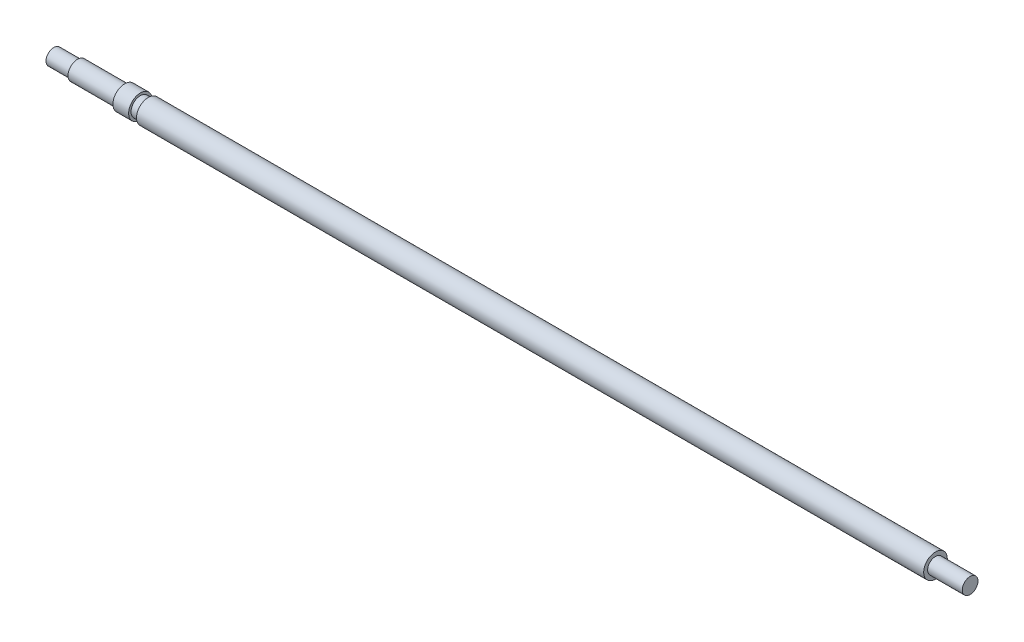
ISO-10303-21;
HEADER;
FILE_DESCRIPTION(('STEP AP214'),'2;1');
FILE_NAME('part.step','',(''),(''),'','','');
FILE_SCHEMA(('AUTOMOTIVE_DESIGN { 1 0 10303 214 1 1 1 1 }'));
ENDSEC;
DATA;
#1=APPLICATION_CONTEXT('core data for automotive mechanical design processes');
#2=APPLICATION_PROTOCOL_DEFINITION('international standard','automotive_design',2000,#1);
#3=PRODUCT_CONTEXT('',#1,'mechanical');
#4=PRODUCT('Part','Part','',(#3));
#5=PRODUCT_RELATED_PRODUCT_CATEGORY('part','',(#4));
#6=PRODUCT_DEFINITION_FORMATION('','',#4);
#7=PRODUCT_DEFINITION_CONTEXT('part definition',#1,'design');
#8=PRODUCT_DEFINITION('design','',#6,#7);
#9=PRODUCT_DEFINITION_SHAPE('','',#8);
#10=(LENGTH_UNIT() NAMED_UNIT(*) SI_UNIT(.MILLI.,.METRE.));
#11=(NAMED_UNIT(*) PLANE_ANGLE_UNIT() SI_UNIT($,.RADIAN.));
#12=(NAMED_UNIT(*) SI_UNIT($,.STERADIAN.) SOLID_ANGLE_UNIT());
#13=UNCERTAINTY_MEASURE_WITH_UNIT(LENGTH_MEASURE(1.E-05),#10,'distance_accuracy_value','');
#14=(GEOMETRIC_REPRESENTATION_CONTEXT(3) GLOBAL_UNCERTAINTY_ASSIGNED_CONTEXT((#13)) GLOBAL_UNIT_ASSIGNED_CONTEXT((#10,
#11,#12)) REPRESENTATION_CONTEXT('',''));
#15=CARTESIAN_POINT('',(0.,0.,0.));
#16=DIRECTION('',(0.,0.,1.));
#17=DIRECTION('',(1.,0.,0.));
#18=AXIS2_PLACEMENT_3D('',#15,#16,#17);
#19=CARTESIAN_POINT('',(3983.11986087225,589.332150706548,0.));
#20=DIRECTION('',(-1.,0.,0.));
#21=DIRECTION('',(0.,0.,1.));
#22=AXIS2_PLACEMENT_3D('',#19,#20,#21);
#23=PLANE('',#22);
#24=CARTESIAN_POINT('',(3983.11986087225,584.332150706548,0.));
#25=DIRECTION('',(1.,0.,0.));
#26=DIRECTION('',(0.,0.,-1.));
#27=AXIS2_PLACEMENT_3D('',#24,#25,#26);
#28=CIRCLE('',#27,5.);
#29=CARTESIAN_POINT('',(3983.11986087225,584.332150706548,-5.));
#30=VERTEX_POINT('',#29);
#31=EDGE_CURVE('E10',#30,#30,#28,.T.);
#32=ORIENTED_EDGE('',*,*,#31,.F.);
#33=EDGE_LOOP('',(#32));
#34=FACE_BOUND('',#33,.T.);
#35=ADVANCED_FACE('F31',(#34),#23,.T.);
#36=CARTESIAN_POINT('',(4565.11986087225,584.332150706548,0.));
#37=DIRECTION('',(1.,0.,0.));
#38=DIRECTION('',(0.,0.,-1.));
#39=AXIS2_PLACEMENT_3D('',#36,#37,#38);
#40=CYLINDRICAL_SURFACE('',#39,5.);
#41=ORIENTED_EDGE('',*,*,#31,.T.);
#42=EDGE_LOOP('',(#41));
#43=FACE_BOUND('',#42,.T.);
#44=CARTESIAN_POINT('',(3998.11986087225,584.332150706548,0.));
#45=DIRECTION('',(1.,0.,0.));
#46=DIRECTION('',(0.,0.,-1.));
#47=AXIS2_PLACEMENT_3D('',#44,#45,#46);
#48=CIRCLE('',#47,5.);
#49=CARTESIAN_POINT('',(3998.11986087225,584.332150706548,-5.));
#50=VERTEX_POINT('',#49);
#51=EDGE_CURVE('E37',#50,#50,#48,.T.);
#52=ORIENTED_EDGE('',*,*,#51,.F.);
#53=EDGE_LOOP('',(#52));
#54=FACE_BOUND('',#53,.T.);
#55=ADVANCED_FACE('F91',(#43,#54),#40,.T.);
#56=CARTESIAN_POINT('',(3998.11986087225,589.332150706548,0.));
#57=DIRECTION('',(-1.,0.,0.));
#58=DIRECTION('',(0.,0.,1.));
#59=AXIS2_PLACEMENT_3D('',#56,#57,#58);
#60=PLANE('',#59);
#61=ORIENTED_EDGE('',*,*,#51,.T.);
#62=EDGE_LOOP('',(#61));
#63=FACE_BOUND('',#62,.T.);
#64=CARTESIAN_POINT('',(3998.11986087225,584.332150706548,0.));
#65=DIRECTION('',(1.,0.,0.));
#66=DIRECTION('',(0.,0.,-1.));
#67=AXIS2_PLACEMENT_3D('',#64,#65,#66);
#68=CIRCLE('',#67,6.00000000000001);
#69=CARTESIAN_POINT('',(3998.11986087225,584.332150706548,-6.00000000000001));
#70=VERTEX_POINT('',#69);
#71=EDGE_CURVE('E41',#70,#70,#68,.T.);
#72=ORIENTED_EDGE('',*,*,#71,.F.);
#73=EDGE_LOOP('',(#72));
#74=FACE_BOUND('',#73,.T.);
#75=ADVANCED_FACE('F96',(#63,#74),#60,.T.);
#76=CARTESIAN_POINT('',(4565.11986087225,584.332150706548,0.));
#77=DIRECTION('',(1.,0.,0.));
#78=DIRECTION('',(0.,0.,-1.));
#79=AXIS2_PLACEMENT_3D('',#76,#77,#78);
#80=CYLINDRICAL_SURFACE('',#79,6.00000000000001);
#81=ORIENTED_EDGE('',*,*,#71,.T.);
#82=EDGE_LOOP('',(#81));
#83=FACE_BOUND('',#82,.T.);
#84=CARTESIAN_POINT('',(4028.11986087225,584.332150706548,0.));
#85=DIRECTION('',(1.,0.,0.));
#86=DIRECTION('',(0.,0.,-1.));
#87=AXIS2_PLACEMENT_3D('',#84,#85,#86);
#88=CIRCLE('',#87,6.00000000000001);
#89=CARTESIAN_POINT('',(4028.11986087225,584.332150706548,-6.00000000000001));
#90=VERTEX_POINT('',#89);
#91=EDGE_CURVE('E45',#90,#90,#88,.T.);
#92=ORIENTED_EDGE('',*,*,#91,.F.);
#93=EDGE_LOOP('',(#92));
#94=FACE_BOUND('',#93,.T.);
#95=ADVANCED_FACE('F100',(#83,#94),#80,.T.);
#96=CARTESIAN_POINT('',(4028.11986087225,590.332150706548,0.));
#97=DIRECTION('',(-1.,0.,0.));
#98=DIRECTION('',(0.,0.,1.));
#99=AXIS2_PLACEMENT_3D('',#96,#97,#98);
#100=PLANE('',#99);
#101=ORIENTED_EDGE('',*,*,#91,.T.);
#102=EDGE_LOOP('',(#101));
#103=FACE_BOUND('',#102,.T.);
#104=CARTESIAN_POINT('',(4028.11986087225,584.332150706548,0.));
#105=DIRECTION('',(1.,0.,0.));
#106=DIRECTION('',(0.,0.,-1.));
#107=AXIS2_PLACEMENT_3D('',#104,#105,#106);
#108=CIRCLE('',#107,7.49999999999995);
#109=CARTESIAN_POINT('',(4028.11986087225,584.332150706548,-7.49999999999995));
#110=VERTEX_POINT('',#109);
#111=EDGE_CURVE('E50',#110,#110,#108,.T.);
#112=ORIENTED_EDGE('',*,*,#111,.F.);
#113=EDGE_LOOP('',(#112));
#114=FACE_BOUND('',#113,.T.);
#115=ADVANCED_FACE('F106',(#103,#114),#100,.T.);
#116=CARTESIAN_POINT('',(4565.11986087225,584.332150706548,0.));
#117=DIRECTION('',(1.,0.,0.));
#118=DIRECTION('',(0.,0.,-1.));
#119=AXIS2_PLACEMENT_3D('',#116,#117,#118);
#120=CYLINDRICAL_SURFACE('',#119,7.49999999999995);
#121=ORIENTED_EDGE('',*,*,#111,.T.);
#122=EDGE_LOOP('',(#121));
#123=FACE_BOUND('',#122,.T.);
#124=CARTESIAN_POINT('',(4038.11986087225,584.332150706548,0.));
#125=DIRECTION('',(1.,0.,0.));
#126=DIRECTION('',(0.,0.,-1.));
#127=AXIS2_PLACEMENT_3D('',#124,#125,#126);
#128=CIRCLE('',#127,7.49999999999995);
#129=CARTESIAN_POINT('',(4038.11986087225,584.332150706548,-7.49999999999995));
#130=VERTEX_POINT('',#129);
#131=EDGE_CURVE('E53',#130,#130,#128,.T.);
#132=ORIENTED_EDGE('',*,*,#131,.F.);
#133=EDGE_LOOP('',(#132));
#134=FACE_BOUND('',#133,.T.);
#135=ADVANCED_FACE('F110',(#123,#134),#120,.T.);
#136=CARTESIAN_POINT('',(4038.11986087225,590.332150706548,0.));
#137=DIRECTION('',(1.,0.,0.));
#138=DIRECTION('',(0.,0.,-1.));
#139=AXIS2_PLACEMENT_3D('',#136,#137,#138);
#140=PLANE('',#139);
#141=ORIENTED_EDGE('',*,*,#131,.T.);
#142=EDGE_LOOP('',(#141));
#143=FACE_BOUND('',#142,.T.);
#144=CARTESIAN_POINT('',(4038.11986087225,584.332150706548,0.));
#145=DIRECTION('',(1.,0.,0.));
#146=DIRECTION('',(0.,0.,-1.));
#147=AXIS2_PLACEMENT_3D('',#144,#145,#146);
#148=CIRCLE('',#147,6.00000000000001);
#149=CARTESIAN_POINT('',(4038.11986087225,584.332150706548,-6.00000000000001));
#150=VERTEX_POINT('',#149);
#151=EDGE_CURVE('E56',#150,#150,#148,.T.);
#152=ORIENTED_EDGE('',*,*,#151,.F.);
#153=EDGE_LOOP('',(#152));
#154=FACE_BOUND('',#153,.T.);
#155=ADVANCED_FACE('F114',(#143,#154),#140,.T.);
#156=CARTESIAN_POINT('',(4565.11986087225,584.332150706548,0.));
#157=DIRECTION('',(1.,0.,0.));
#158=DIRECTION('',(0.,0.,-1.));
#159=AXIS2_PLACEMENT_3D('',#156,#157,#158);
#160=CYLINDRICAL_SURFACE('',#159,6.00000000000001);
#161=ORIENTED_EDGE('',*,*,#151,.T.);
#162=EDGE_LOOP('',(#161));
#163=FACE_BOUND('',#162,.T.);
#164=CARTESIAN_POINT('',(4043.11986087225,584.332150706548,0.));
#165=DIRECTION('',(1.,0.,0.));
#166=DIRECTION('',(0.,0.,-1.));
#167=AXIS2_PLACEMENT_3D('',#164,#165,#166);
#168=CIRCLE('',#167,6.00000000000001);
#169=CARTESIAN_POINT('',(4043.11986087225,584.332150706548,-6.00000000000001));
#170=VERTEX_POINT('',#169);
#171=EDGE_CURVE('E59',#170,#170,#168,.T.);
#172=ORIENTED_EDGE('',*,*,#171,.F.);
#173=EDGE_LOOP('',(#172));
#174=FACE_BOUND('',#173,.T.);
#175=ADVANCED_FACE('F118',(#163,#174),#160,.T.);
#176=CARTESIAN_POINT('',(4043.11986087225,590.332150706548,0.));
#177=DIRECTION('',(-1.,0.,0.));
#178=DIRECTION('',(0.,0.,1.));
#179=AXIS2_PLACEMENT_3D('',#176,#177,#178);
#180=PLANE('',#179);
#181=ORIENTED_EDGE('',*,*,#171,.T.);
#182=EDGE_LOOP('',(#181));
#183=FACE_BOUND('',#182,.T.);
#184=CARTESIAN_POINT('',(4043.11986087225,584.332150706548,0.));
#185=DIRECTION('',(1.,0.,0.));
#186=DIRECTION('',(0.,0.,-1.));
#187=AXIS2_PLACEMENT_3D('',#184,#185,#186);
#188=CIRCLE('',#187,7.49999999999995);
#189=CARTESIAN_POINT('',(4043.11986087225,584.332150706548,-7.49999999999995));
#190=VERTEX_POINT('',#189);
#191=EDGE_CURVE('E62',#190,#190,#188,.T.);
#192=ORIENTED_EDGE('',*,*,#191,.F.);
#193=EDGE_LOOP('',(#192));
#194=FACE_BOUND('',#193,.T.);
#195=ADVANCED_FACE('F122',(#183,#194),#180,.T.);
#196=CARTESIAN_POINT('',(4565.11986087225,584.332150706548,0.));
#197=DIRECTION('',(1.,0.,0.));
#198=DIRECTION('',(0.,0.,-1.));
#199=AXIS2_PLACEMENT_3D('',#196,#197,#198);
#200=CYLINDRICAL_SURFACE('',#199,7.49999999999995);
#201=ORIENTED_EDGE('',*,*,#191,.T.);
#202=EDGE_LOOP('',(#201));
#203=FACE_BOUND('',#202,.T.);
#204=CARTESIAN_POINT('',(4543.11986087225,584.332150706548,0.));
#205=DIRECTION('',(1.,0.,0.));
#206=DIRECTION('',(0.,0.,-1.));
#207=AXIS2_PLACEMENT_3D('',#204,#205,#206);
#208=CIRCLE('',#207,7.49999999999995);
#209=CARTESIAN_POINT('',(4543.11986087225,584.332150706548,-7.49999999999995));
#210=VERTEX_POINT('',#209);
#211=EDGE_CURVE('E65',#210,#210,#208,.T.);
#212=ORIENTED_EDGE('',*,*,#211,.F.);
#213=EDGE_LOOP('',(#212));
#214=FACE_BOUND('',#213,.T.);
#215=ADVANCED_FACE('F87',(#203,#214),#200,.T.);
#216=CARTESIAN_POINT('',(4543.11986087225,591.832150706548,0.));
#217=DIRECTION('',(1.,0.,0.));
#218=DIRECTION('',(0.,0.,-1.));
#219=AXIS2_PLACEMENT_3D('',#216,#217,#218);
#220=PLANE('',#219);
#221=ORIENTED_EDGE('',*,*,#211,.T.);
#222=EDGE_LOOP('',(#221));
#223=FACE_BOUND('',#222,.T.);
#224=CARTESIAN_POINT('',(4543.11986087225,584.332150706548,0.));
#225=DIRECTION('',(1.,0.,0.));
#226=DIRECTION('',(0.,0.,-1.));
#227=AXIS2_PLACEMENT_3D('',#224,#225,#226);
#228=CIRCLE('',#227,5.);
#229=CARTESIAN_POINT('',(4543.11986087225,584.332150706548,-5.));
#230=VERTEX_POINT('',#229);
#231=EDGE_CURVE('E68',#230,#230,#228,.T.);
#232=ORIENTED_EDGE('',*,*,#231,.F.);
#233=EDGE_LOOP('',(#232));
#234=FACE_BOUND('',#233,.T.);
#235=ADVANCED_FACE('F79',(#223,#234),#220,.T.);
#236=CARTESIAN_POINT('',(4565.11986087225,584.332150706548,0.));
#237=DIRECTION('',(1.,0.,0.));
#238=DIRECTION('',(0.,0.,-1.));
#239=AXIS2_PLACEMENT_3D('',#236,#237,#238);
#240=CYLINDRICAL_SURFACE('',#239,5.);
#241=ORIENTED_EDGE('',*,*,#231,.T.);
#242=EDGE_LOOP('',(#241));
#243=FACE_BOUND('',#242,.T.);
#244=CARTESIAN_POINT('',(4565.11986087225,584.332150706548,0.));
#245=DIRECTION('',(1.,0.,0.));
#246=DIRECTION('',(0.,0.,-1.));
#247=AXIS2_PLACEMENT_3D('',#244,#245,#246);
#248=CIRCLE('',#247,5.);
#249=CARTESIAN_POINT('',(4565.11986087225,584.332150706548,-5.));
#250=VERTEX_POINT('',#249);
#251=EDGE_CURVE('E71',#250,#250,#248,.T.);
#252=ORIENTED_EDGE('',*,*,#251,.F.);
#253=EDGE_LOOP('',(#252));
#254=FACE_BOUND('',#253,.T.);
#255=ADVANCED_FACE('F77',(#243,#254),#240,.T.);
#256=CARTESIAN_POINT('',(4565.11986087225,589.332150706548,0.));
#257=DIRECTION('',(1.,0.,0.));
#258=DIRECTION('',(0.,0.,-1.));
#259=AXIS2_PLACEMENT_3D('',#256,#257,#258);
#260=PLANE('',#259);
#261=ORIENTED_EDGE('',*,*,#251,.T.);
#262=EDGE_LOOP('',(#261));
#263=FACE_BOUND('',#262,.T.);
#264=ADVANCED_FACE('F75',(#263),#260,.T.);
#265=CLOSED_SHELL('',(#35,#55,#75,#95,#115,#135,#155,#175,#195,#215,#235,#255,#264));
#266=MANIFOLD_SOLID_BREP('B2',#265);
#267=ADVANCED_BREP_SHAPE_REPRESENTATION('',(#18,#266),#14);
#268=SHAPE_DEFINITION_REPRESENTATION(#9,#267);
ENDSEC;
END-ISO-10303-21;
